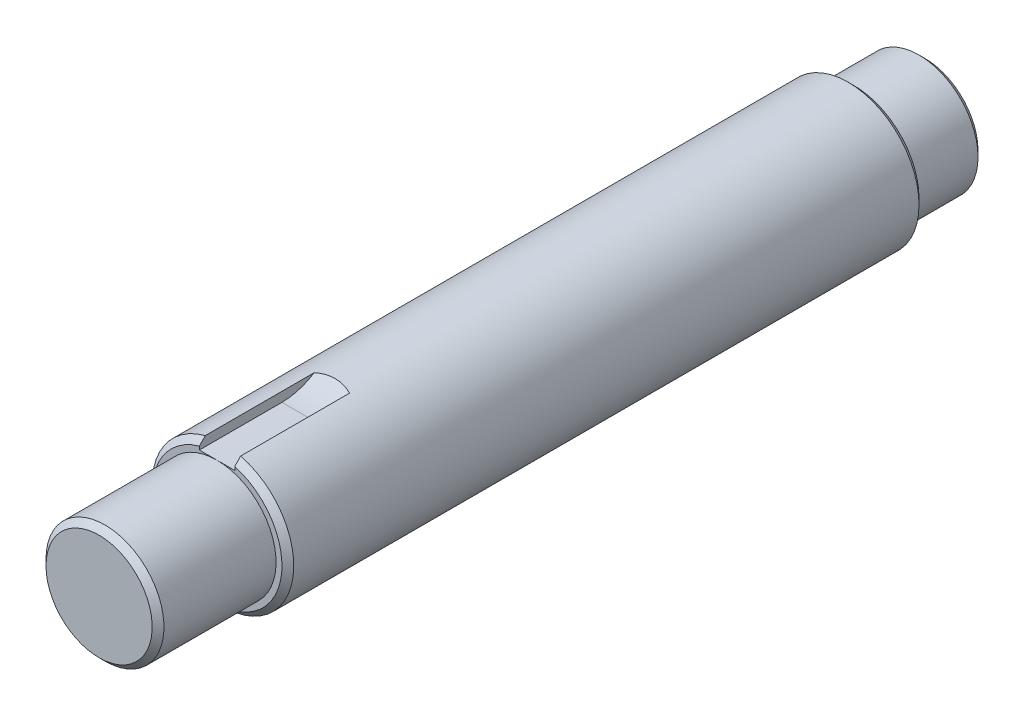
ISO-10303-21;
HEADER;
FILE_DESCRIPTION(('STEP AP214'),'2;1');
FILE_NAME('part.step','',(''),(''),'','','');
FILE_SCHEMA(('AUTOMOTIVE_DESIGN { 1 0 10303 214 1 1 1 1 }'));
ENDSEC;
DATA;
#1=APPLICATION_CONTEXT('core data for automotive mechanical design processes');
#2=APPLICATION_PROTOCOL_DEFINITION('international standard','automotive_design',2000,#1);
#3=PRODUCT_CONTEXT('',#1,'mechanical');
#4=PRODUCT('Part','Part','',(#3));
#5=PRODUCT_RELATED_PRODUCT_CATEGORY('part','',(#4));
#6=PRODUCT_DEFINITION_FORMATION('','',#4);
#7=PRODUCT_DEFINITION_CONTEXT('part definition',#1,'design');
#8=PRODUCT_DEFINITION('design','',#6,#7);
#9=PRODUCT_DEFINITION_SHAPE('','',#8);
#10=(LENGTH_UNIT() NAMED_UNIT(*) SI_UNIT(.MILLI.,.METRE.));
#11=(NAMED_UNIT(*) PLANE_ANGLE_UNIT() SI_UNIT($,.RADIAN.));
#12=(NAMED_UNIT(*) SI_UNIT($,.STERADIAN.) SOLID_ANGLE_UNIT());
#13=UNCERTAINTY_MEASURE_WITH_UNIT(LENGTH_MEASURE(1.E-05),#10,'distance_accuracy_value','');
#14=(GEOMETRIC_REPRESENTATION_CONTEXT(3) GLOBAL_UNCERTAINTY_ASSIGNED_CONTEXT((#13)) GLOBAL_UNIT_ASSIGNED_CONTEXT((#10,
#11,#12)) REPRESENTATION_CONTEXT('',''));
#15=CARTESIAN_POINT('',(0.,0.,0.));
#16=DIRECTION('',(0.,0.,1.));
#17=DIRECTION('',(1.,0.,0.));
#18=AXIS2_PLACEMENT_3D('',#15,#16,#17);
#19=CARTESIAN_POINT('',(0.,0.,59.9999999999999));
#20=DIRECTION('',(0.,0.,-0.999999999999999));
#21=DIRECTION('',(-1.,0.,0.));
#22=AXIS2_PLACEMENT_3D('',#19,#20,#21);
#23=CYLINDRICAL_SURFACE('',#22,6.);
#24=CARTESIAN_POINT('',(0.,0.,6.50000000000001));
#25=DIRECTION('',(0.,0.,0.999999999999999));
#26=DIRECTION('',(1.,0.,0.));
#27=AXIS2_PLACEMENT_3D('',#24,#25,#26);
#28=CIRCLE('',#27,6.);
#29=CARTESIAN_POINT('',(6.00000000000001,0.,6.50000000000001));
#30=VERTEX_POINT('',#29);
#31=EDGE_CURVE('E137',#30,#30,#28,.T.);
#32=ORIENTED_EDGE('',*,*,#31,.T.);
#33=EDGE_LOOP('',(#32));
#34=FACE_BOUND('',#33,.T.);
#35=DIRECTION('',(0.,0.,-0.999999999999999));
#36=VECTOR('',#35,1.);
#37=CARTESIAN_POINT('',(-1.50000000000001,5.80947501931113,59.9999999999999));
#38=LINE('',#37,#36);
#39=CARTESIAN_POINT('',(-1.50000000000001,5.80947501931113,50.2724552457892));
#40=VERTEX_POINT('',#39);
#41=CARTESIAN_POINT('',(-1.50000000000001,5.80947501931113,59.4999999999999));
#42=VERTEX_POINT('',#41);
#43=EDGE_CURVE('E123',#40,#42,#38,.F.);
#44=ORIENTED_EDGE('',*,*,#43,.F.);
#45=CARTESIAN_POINT('',(-1.50000000000001,5.80947501931113,50.2724552457892));
#46=CARTESIAN_POINT('',(-1.41080581062758,5.83252696194827,50.2370749961732));
#47=CARTESIAN_POINT('',(-1.31975291206148,5.85382425720757,50.2053002619477));
#48=CARTESIAN_POINT('',(-1.13471485218547,5.89247677973145,50.1487761297571));
#49=CARTESIAN_POINT('',(-1.0407308387278,5.90983352864103,50.1240240190756));
#50=CARTESIAN_POINT('',(-0.850537159187262,5.94019201410184,50.0813304918829));
#51=CARTESIAN_POINT('',(-0.75432729761696,5.95319336657167,50.0633896760084));
#52=CARTESIAN_POINT('',(-0.560390568806688,5.97456907787226,50.0341548308636));
#53=CARTESIAN_POINT('',(-0.462663583888499,5.98294307591221,50.0228613198734));
#54=CARTESIAN_POINT('',(-0.266489168146344,5.99488378340502,50.0068172396103));
#55=CARTESIAN_POINT('',(-0.168042613928242,5.99845559531514,50.00205972554));
#56=CARTESIAN_POINT('',(0.0290064624173928,6.0007389171753,49.9990144079675));
#57=CARTESIAN_POINT('',(0.127608985703024,5.99945039086553,50.000726652732));
#58=CARTESIAN_POINT('',(0.324204679953278,5.99204094373895,50.0106350249763));
#59=CARTESIAN_POINT('',(0.422198385699468,5.98592514257701,50.0188242831594));
#60=CARTESIAN_POINT('',(0.616969267627237,5.96899562609556,50.0417565395766));
#61=CARTESIAN_POINT('',(0.713746767723083,5.9581831901451,50.0564977530755));
#62=CARTESIAN_POINT('',(0.928516110138473,5.92893182145794,50.0970391777133));
#63=CARTESIAN_POINT('',(1.04601589722992,5.90928444863197,50.1246458887623));
#64=CARTESIAN_POINT('',(1.21896998486667,5.87516597703851,50.1740244933161));
#65=CARTESIAN_POINT('',(1.27606104206496,5.86302146491975,50.1918077842138));
#66=CARTESIAN_POINT('',(1.38900170229353,5.83729650378941,50.2300851731379));
#67=CARTESIAN_POINT('',(1.44485121338124,5.82371594885773,50.2505794711517));
#68=CARTESIAN_POINT('',(1.5,5.80947501931112,50.2724552457892));
#69=B_SPLINE_CURVE_WITH_KNOTS('',3,(#45,#46,#47,#48,#49,#50,#51,#52,#53,#54,#55,#56,#57,#58,#59,
#60,#61,#62,#63,#64,#65,#66,#67,#68),.UNSPECIFIED.,.F.,.F.,(4,2,2,2,2,2,2,2,2,2,2,4),(0.,
0.29592502580249,0.59173558482833,0.887572223097387,1.18343192423877,1.47897701706527,
1.77452431476525,2.06975858484294,2.36491248312871,2.73100974529955,2.91398552442623,
3.09697480896419),.UNSPECIFIED.);
#70=CARTESIAN_POINT('',(1.49999999999999,5.80947501931112,50.2724552457892));
#71=VERTEX_POINT('',#70);
#72=EDGE_CURVE('E11',#40,#71,#69,.T.);
#73=ORIENTED_EDGE('',*,*,#72,.T.);
#74=DIRECTION('',(0.,0.,-0.999999999999999));
#75=VECTOR('',#74,1.);
#76=CARTESIAN_POINT('',(1.49999999999999,5.80947501931112,59.9999999999999));
#77=LINE('',#76,#75);
#78=CARTESIAN_POINT('',(1.49999999999999,5.80947501931112,59.4999999999999));
#79=VERTEX_POINT('',#78);
#80=EDGE_CURVE('E119',#71,#79,#77,.F.);
#81=ORIENTED_EDGE('',*,*,#80,.T.);
#82=CARTESIAN_POINT('',(0.,0.,59.4999999999999));
#83=DIRECTION('',(0.,0.,0.999999999999999));
#84=DIRECTION('',(1.,0.,0.));
#85=AXIS2_PLACEMENT_3D('',#82,#83,#84);
#86=CIRCLE('',#85,6.);
#87=EDGE_CURVE('E140',#79,#42,#86,.F.);
#88=ORIENTED_EDGE('',*,*,#87,.T.);
#89=EDGE_LOOP('',(#44,#73,#81,#88));
#90=FACE_BOUND('',#89,.T.);
#91=ADVANCED_FACE('F34',(#34,#90),#23,.T.);
#92=CARTESIAN_POINT('',(0.,0.,59.9999999999999));
#93=DIRECTION('',(0.,0.,0.999999999999999));
#94=DIRECTION('',(1.,0.,0.));
#95=AXIS2_PLACEMENT_3D('',#92,#93,#94);
#96=PLANE('',#95);
#97=DIRECTION('',(1.,0.,0.));
#98=VECTOR('',#97,1.);
#99=CARTESIAN_POINT('',(-1.50000000000001,5.,59.9999999999999));
#100=LINE('',#99,#98);
#101=CARTESIAN_POINT('',(-1.50000000000001,5.,59.9999999999999));
#102=VERTEX_POINT('',#101);
#103=CARTESIAN_POINT('',(0.,5.,59.9999999999999));
#104=VERTEX_POINT('',#103);
#105=EDGE_CURVE('E63',#102,#104,#100,.T.);
#106=ORIENTED_EDGE('',*,*,#105,.F.);
#107=DIRECTION('',(0.,-1.,0.));
#108=VECTOR('',#107,1.);
#109=CARTESIAN_POINT('',(-1.50000000000001,5.,59.9999999999999));
#110=LINE('',#109,#108);
#111=CARTESIAN_POINT('',(-1.50000000000001,5.29150262212917,59.9999999999999));
#112=VERTEX_POINT('',#111);
#113=EDGE_CURVE('E111',#112,#102,#110,.T.);
#114=ORIENTED_EDGE('',*,*,#113,.F.);
#115=CARTESIAN_POINT('',(0.,0.,59.9999999999999));
#116=DIRECTION('',(0.,0.,0.999999999999999));
#117=DIRECTION('',(1.,0.,0.));
#118=AXIS2_PLACEMENT_3D('',#115,#116,#117);
#119=CIRCLE('',#118,5.49999999999999);
#120=CARTESIAN_POINT('',(1.5,5.29150262212917,59.9999999999999));
#121=VERTEX_POINT('',#120);
#122=EDGE_CURVE('E107',#112,#121,#119,.T.);
#123=ORIENTED_EDGE('',*,*,#122,.T.);
#124=DIRECTION('',(0.,-1.,0.));
#125=VECTOR('',#124,1.);
#126=CARTESIAN_POINT('',(1.5,5.,59.9999999999999));
#127=LINE('',#126,#125);
#128=CARTESIAN_POINT('',(1.5,5.,59.9999999999999));
#129=VERTEX_POINT('',#128);
#130=EDGE_CURVE('E55',#121,#129,#127,.T.);
#131=ORIENTED_EDGE('',*,*,#130,.T.);
#132=EDGE_CURVE('E90',#104,#129,#100,.T.);
#133=ORIENTED_EDGE('',*,*,#132,.F.);
#134=CARTESIAN_POINT('',(0.,0.,59.9999999999999));
#135=DIRECTION('',(0.,0.,0.999999999999999));
#136=DIRECTION('',(1.,0.,0.));
#137=AXIS2_PLACEMENT_3D('',#134,#135,#136);
#138=CIRCLE('',#137,5.);
#139=EDGE_CURVE('E126',#104,#104,#138,.T.);
#140=ORIENTED_EDGE('',*,*,#139,.F.);
#141=EDGE_LOOP('',(#106,#114,#123,#131,#133,#140));
#142=FACE_BOUND('',#141,.T.);
#143=ADVANCED_FACE('F104',(#142),#96,.T.);
#144=CARTESIAN_POINT('',(0.,0.,59.9999999999999));
#145=DIRECTION('',(0.,0.,-0.999999999999999));
#146=DIRECTION('',(-1.,0.,0.));
#147=AXIS2_PLACEMENT_3D('',#144,#145,#146);
#148=CONICAL_SURFACE('',#147,5.49999999999999,0.785398163397457);
#149=ORIENTED_EDGE('',*,*,#122,.F.);
#150=CARTESIAN_POINT('',(-1.50000000000001,3.78688131140673,61.4268599254773));
#151=CARTESIAN_POINT('',(-1.50000000000002,3.92239127179272,61.3008487424899));
#152=CARTESIAN_POINT('',(-1.50000000000002,4.05746801487185,61.1743740341473));
#153=CARTESIAN_POINT('',(-1.50000000000002,4.32692172834275,60.9206840027584));
#154=CARTESIAN_POINT('',(-1.50000000000002,4.46129870642971,60.7934686878892));
#155=CARTESIAN_POINT('',(-1.50000000000002,4.72951798701452,60.5384854138287));
#156=CARTESIAN_POINT('',(-1.50000000000002,4.86336030747444,60.4107174735086));
#157=CARTESIAN_POINT('',(-1.50000000000002,5.13062222915721,60.1547395589055));
#158=CARTESIAN_POINT('',(-1.50000000000001,5.26404182903892,60.0265295832228));
#159=CARTESIAN_POINT('',(-1.5,5.66378893682127,59.641384070027));
#160=CARTESIAN_POINT('',(-1.50000000000001,5.9296125128232,59.3839255477714));
#161=CARTESIAN_POINT('',(-1.50000000000002,6.32767526900221,58.9970376496472));
#162=CARTESIAN_POINT('',(-1.50000000000002,6.46025309092337,58.8679560429901));
#163=CARTESIAN_POINT('',(-1.50000000000002,6.72521616722907,58.6095959701382));
#164=CARTESIAN_POINT('',(-1.50000000000001,6.85760142208265,58.4803175044244));
#165=CARTESIAN_POINT('',(-1.50000000000001,6.98990732419963,58.350957798355));
#166=B_SPLINE_CURVE_WITH_KNOTS('',3,(#150,#151,#152,#153,#154,#155,#156,#157,#158,#159,#160,
#161,#162,#163,#164,#165),.UNSPECIFIED.,.F.,.F.,(4,2,2,2,2,2,2,4),(0.,0.555132552760562,
1.11025898788033,1.66536661373076,2.22047599898528,3.33066260466195,3.88577553498256,
4.44088711094073),.UNSPECIFIED.);
#167=EDGE_CURVE('E48',#112,#42,#166,.T.);
#168=ORIENTED_EDGE('',*,*,#167,.T.);
#169=ORIENTED_EDGE('',*,*,#87,.F.);
#170=CARTESIAN_POINT('',(1.5,3.78688131140673,61.4268599254773));
#171=CARTESIAN_POINT('',(1.49999999999999,3.92239127179272,61.3008487424899));
#172=CARTESIAN_POINT('',(1.49999999999999,4.05746801487185,61.1743740341473));
#173=CARTESIAN_POINT('',(1.49999999999998,4.32692172834275,60.9206840027584));
#174=CARTESIAN_POINT('',(1.49999999999999,4.46129870642971,60.7934686878892));
#175=CARTESIAN_POINT('',(1.49999999999999,4.72951798701452,60.5384854138287));
#176=CARTESIAN_POINT('',(1.49999999999998,4.86336030747444,60.4107174735087));
#177=CARTESIAN_POINT('',(1.49999999999999,5.13062222915722,60.1547395589055));
#178=CARTESIAN_POINT('',(1.49999999999999,5.26404182903892,60.0265295832228));
#179=CARTESIAN_POINT('',(1.5,5.66378893682126,59.641384070027));
#180=CARTESIAN_POINT('',(1.49999999999999,5.9296125128232,59.3839255477714));
#181=CARTESIAN_POINT('',(1.49999999999999,6.32767526900221,58.9970376496473));
#182=CARTESIAN_POINT('',(1.49999999999999,6.46025309092337,58.8679560429902));
#183=CARTESIAN_POINT('',(1.49999999999999,6.72521616722907,58.6095959701382));
#184=CARTESIAN_POINT('',(1.49999999999999,6.85760142208266,58.4803175044244));
#185=CARTESIAN_POINT('',(1.5,6.98990732419963,58.350957798355));
#186=B_SPLINE_CURVE_WITH_KNOTS('',3,(#170,#171,#172,#173,#174,#175,#176,#177,#178,#179,#180,
#181,#182,#183,#184,#185),.UNSPECIFIED.,.F.,.F.,(4,2,2,2,2,2,2,4),(0.,0.555132552760563,
1.11025898788033,1.66536661373076,2.22047599898528,3.33066260466195,3.88577553498256,
4.44088711094074),.UNSPECIFIED.);
#187=EDGE_CURVE('E152',#121,#79,#186,.T.);
#188=ORIENTED_EDGE('',*,*,#187,.F.);
#189=EDGE_LOOP('',(#149,#168,#169,#188));
#190=FACE_BOUND('',#189,.T.);
#191=ADVANCED_FACE('F164',(#190),#148,.T.);
#192=CARTESIAN_POINT('',(0.,0.,6.00000000000001));
#193=DIRECTION('',(0.,0.,-0.999999999999999));
#194=DIRECTION('',(-1.,0.,0.));
#195=AXIS2_PLACEMENT_3D('',#192,#193,#194);
#196=CYLINDRICAL_SURFACE('',#195,5.);
#197=CARTESIAN_POINT('',(0.,0.,0.500000000000014));
#198=DIRECTION('',(0.,0.,0.999999999999999));
#199=DIRECTION('',(1.,0.,0.));
#200=AXIS2_PLACEMENT_3D('',#197,#198,#199);
#201=CIRCLE('',#200,5.);
#202=CARTESIAN_POINT('',(-5.00000000000001,0.,0.500000000000014));
#203=VERTEX_POINT('',#202);
#204=EDGE_CURVE('E146',#203,#203,#201,.T.);
#205=CARTESIAN_POINT('',(0.,0.,6.00000000000001));
#206=DIRECTION('',(0.,0.,0.999999999999999));
#207=DIRECTION('',(1.,0.,0.));
#208=AXIS2_PLACEMENT_3D('',#205,#206,#207);
#209=CIRCLE('',#208,5.);
#210=CARTESIAN_POINT('',(-5.00000000000001,0.,6.));
#211=VERTEX_POINT('',#210);
#212=EDGE_CURVE('E125',#211,#211,#209,.T.);
#213=CARTESIAN_POINT('',(-5.00000000000001,0.,0.500000000000014));
#214=CARTESIAN_POINT('',(-5.00000000000001,0.,0.557291666666681));
#215=CARTESIAN_POINT('',(-5.00000000000001,0.,0.614583333333347));
#216=CARTESIAN_POINT('',(-5.00000000000001,0.,0.72916666666668));
#217=CARTESIAN_POINT('',(-5.00000000000001,0.,0.786458333333346));
#218=CARTESIAN_POINT('',(-5.00000000000001,0.,0.90104166666668));
#219=CARTESIAN_POINT('',(-5.00000000000001,0.,0.958333333333346));
#220=CARTESIAN_POINT('',(-5.00000000000001,0.,1.07291666666668));
#221=CARTESIAN_POINT('',(-5.00000000000001,0.,1.13020833333335));
#222=CARTESIAN_POINT('',(-5.00000000000001,0.,1.24479166666668));
#223=CARTESIAN_POINT('',(-5.00000000000001,0.,1.30208333333335));
#224=CARTESIAN_POINT('',(-5.00000000000001,0.,1.41666666666668));
#225=CARTESIAN_POINT('',(-5.00000000000001,0.,1.47395833333335));
#226=CARTESIAN_POINT('',(-5.00000000000001,0.,1.58854166666668));
#227=CARTESIAN_POINT('',(-5.00000000000001,0.,1.64583333333335));
#228=CARTESIAN_POINT('',(-5.00000000000001,0.,1.76041666666668));
#229=CARTESIAN_POINT('',(-5.00000000000001,0.,1.81770833333334));
#230=CARTESIAN_POINT('',(-5.00000000000001,0.,1.93229166666668));
#231=CARTESIAN_POINT('',(-5.00000000000001,0.,1.98958333333334));
#232=CARTESIAN_POINT('',(-5.00000000000001,0.,2.10416666666668));
#233=CARTESIAN_POINT('',(-5.00000000000001,0.,2.16145833333334));
#234=CARTESIAN_POINT('',(-5.00000000000001,0.,2.27604166666668));
#235=CARTESIAN_POINT('',(-5.00000000000001,0.,2.33333333333334));
#236=CARTESIAN_POINT('',(-5.00000000000001,0.,2.44791666666668));
#237=CARTESIAN_POINT('',(-5.00000000000001,0.,2.50520833333334));
#238=CARTESIAN_POINT('',(-5.00000000000001,0.,2.61979166666668));
#239=CARTESIAN_POINT('',(-5.00000000000001,0.,2.67708333333334));
#240=CARTESIAN_POINT('',(-5.00000000000001,0.,2.79166666666668));
#241=CARTESIAN_POINT('',(-5.00000000000001,0.,2.84895833333334));
#242=CARTESIAN_POINT('',(-5.00000000000001,0.,2.96354166666668));
#243=CARTESIAN_POINT('',(-5.00000000000001,0.,3.02083333333334));
#244=CARTESIAN_POINT('',(-5.00000000000001,0.,3.13541666666668));
#245=CARTESIAN_POINT('',(-5.00000000000001,0.,3.19270833333334));
#246=CARTESIAN_POINT('',(-5.00000000000001,0.,3.30729166666668));
#247=CARTESIAN_POINT('',(-5.00000000000001,0.,3.36458333333334));
#248=CARTESIAN_POINT('',(-5.00000000000001,0.,3.47916666666668));
#249=CARTESIAN_POINT('',(-5.00000000000001,0.,3.53645833333334));
#250=CARTESIAN_POINT('',(-5.00000000000001,0.,3.65104166666668));
#251=CARTESIAN_POINT('',(-5.00000000000001,0.,3.70833333333334));
#252=CARTESIAN_POINT('',(-5.00000000000001,0.,3.82291666666667));
#253=CARTESIAN_POINT('',(-5.00000000000001,0.,3.88020833333334));
#254=CARTESIAN_POINT('',(-5.00000000000001,0.,3.99479166666667));
#255=CARTESIAN_POINT('',(-5.00000000000001,0.,4.05208333333334));
#256=CARTESIAN_POINT('',(-5.00000000000001,0.,4.16666666666667));
#257=CARTESIAN_POINT('',(-5.00000000000001,0.,4.22395833333334));
#258=CARTESIAN_POINT('',(-5.00000000000001,0.,4.33854166666667));
#259=CARTESIAN_POINT('',(-5.00000000000001,0.,4.39583333333334));
#260=CARTESIAN_POINT('',(-5.00000000000001,0.,4.51041666666667));
#261=CARTESIAN_POINT('',(-5.00000000000001,0.,4.56770833333334));
#262=CARTESIAN_POINT('',(-5.00000000000001,0.,4.68229166666667));
#263=CARTESIAN_POINT('',(-5.00000000000001,0.,4.73958333333334));
#264=CARTESIAN_POINT('',(-5.00000000000001,0.,4.85416666666667));
#265=CARTESIAN_POINT('',(-5.00000000000001,0.,4.91145833333334));
#266=CARTESIAN_POINT('',(-5.00000000000001,0.,5.02604166666667));
#267=CARTESIAN_POINT('',(-5.00000000000001,0.,5.08333333333334));
#268=CARTESIAN_POINT('',(-5.00000000000001,0.,5.19791666666667));
#269=CARTESIAN_POINT('',(-5.00000000000001,0.,5.25520833333334));
#270=CARTESIAN_POINT('',(-5.00000000000001,0.,5.36979166666667));
#271=CARTESIAN_POINT('',(-5.00000000000001,0.,5.42708333333334));
#272=CARTESIAN_POINT('',(-5.00000000000001,0.,5.54166666666667));
#273=CARTESIAN_POINT('',(-5.00000000000001,0.,5.59895833333334));
#274=CARTESIAN_POINT('',(-5.00000000000001,0.,5.71354166666667));
#275=CARTESIAN_POINT('',(-5.00000000000001,0.,5.77083333333334));
#276=CARTESIAN_POINT('',(-5.00000000000001,0.,5.88541666666667));
#277=CARTESIAN_POINT('',(-5.00000000000001,0.,5.94270833333334));
#278=CARTESIAN_POINT('',(-5.00000000000001,0.,6.));
#279=B_SPLINE_CURVE_WITH_KNOTS('',3,(#213,#214,#215,#216,#217,#218,#219,#220,#221,#222,#223,
#224,#225,#226,#227,#228,#229,#230,#231,#232,#233,#234,#235,#236,#237,#238,#239,#240,#241,#242,
#243,#244,#245,#246,#247,#248,#249,#250,#251,#252,#253,#254,#255,#256,#257,#258,#259,#260,#261,
#262,#263,#264,#265,#266,#267,#268,#269,#270,#271,#272,#273,#274,#275,#276,#277,#278),
.UNSPECIFIED.,.F.,.F.,(4,2,2,2,2,2,2,2,2,2,2,2,2,2,2,2,2,2,2,2,2,2,2,2,2,2,2,2,2,2,2,2,4),(0.,
0.171874999999999,0.343749999999999,0.515624999999999,0.687499999999999,0.859374999999998,
1.03125,1.203125,1.375,1.546875,1.71875,1.890625,2.0625,2.234375,2.40625,2.578125,2.75,
2.92187499999999,3.09374999999999,3.26562499999999,3.43749999999999,3.60937499999999,
3.78124999999999,3.95312499999999,4.12499999999999,4.29687499999999,4.46874999999999,
4.64062499999999,4.81249999999999,4.98437499999999,5.15624999999999,5.32812499999999,
5.49999999999999),.UNSPECIFIED.);
#280=EDGE_CURVE('BSEAM36',#203,#211,#279,.T.);
#281=ORIENTED_EDGE('',*,*,#204,.T.);
#282=ORIENTED_EDGE('',*,*,#212,.F.);
#283=ORIENTED_EDGE('',*,*,#280,.T.);
#284=ORIENTED_EDGE('',*,*,#280,.F.);
#285=EDGE_LOOP('',(#281,#283,#282,#284));
#286=FACE_BOUND('',#285,.T.);
#287=ADVANCED_FACE('F36',(#286),#196,.T.);
#288=CARTESIAN_POINT('',(0.,0.,0.));
#289=DIRECTION('',(0.,0.,0.999999999999999));
#290=DIRECTION('',(1.,0.,0.));
#291=AXIS2_PLACEMENT_3D('',#288,#289,#290);
#292=PLANE('',#291);
#293=CARTESIAN_POINT('',(0.,0.,0.));
#294=DIRECTION('',(0.,0.,0.999999999999999));
#295=DIRECTION('',(1.,0.,0.));
#296=AXIS2_PLACEMENT_3D('',#293,#294,#295);
#297=CIRCLE('',#296,4.5);
#298=CARTESIAN_POINT('',(4.5,0.,0.));
#299=VERTEX_POINT('',#298);
#300=EDGE_CURVE('E149',#299,#299,#297,.F.);
#301=ORIENTED_EDGE('',*,*,#300,.T.);
#302=EDGE_LOOP('',(#301));
#303=FACE_BOUND('',#302,.T.);
#304=ADVANCED_FACE('F204',(#303),#292,.F.);
#305=CARTESIAN_POINT('',(0.,0.,6.00000000000001));
#306=DIRECTION('',(0.,0.,0.999999999999999));
#307=DIRECTION('',(1.,0.,0.));
#308=AXIS2_PLACEMENT_3D('',#305,#306,#307);
#309=PLANE('',#308);
#310=CARTESIAN_POINT('',(0.,0.,6.00000000000001));
#311=DIRECTION('',(0.,0.,0.999999999999999));
#312=DIRECTION('',(1.,0.,0.));
#313=AXIS2_PLACEMENT_3D('',#310,#311,#312);
#314=CIRCLE('',#313,5.5);
#315=CARTESIAN_POINT('',(5.50000000000001,0.,6.00000000000001));
#316=VERTEX_POINT('',#315);
#317=EDGE_CURVE('E143',#316,#316,#314,.F.);
#318=ORIENTED_EDGE('',*,*,#317,.T.);
#319=EDGE_LOOP('',(#318));
#320=FACE_BOUND('',#319,.T.);
#321=ORIENTED_EDGE('',*,*,#212,.T.);
#322=EDGE_LOOP('',(#321));
#323=FACE_BOUND('',#322,.T.);
#324=ADVANCED_FACE('F206',(#320,#323),#309,.F.);
#325=CARTESIAN_POINT('',(0.,0.,69.9999999999999));
#326=DIRECTION('',(0.,0.,-0.999999999999999));
#327=DIRECTION('',(-1.,0.,0.));
#328=AXIS2_PLACEMENT_3D('',#325,#326,#327);
#329=CYLINDRICAL_SURFACE('',#328,5.);
#330=CARTESIAN_POINT('',(0.,0.,69.4999999999999));
#331=DIRECTION('',(0.,0.,0.999999999999999));
#332=DIRECTION('',(1.,0.,0.));
#333=AXIS2_PLACEMENT_3D('',#330,#331,#332);
#334=CIRCLE('',#333,5.);
#335=CARTESIAN_POINT('',(-5.00000000000001,0.,69.4999999999999));
#336=VERTEX_POINT('',#335);
#337=EDGE_CURVE('E133',#336,#336,#334,.F.);
#338=ORIENTED_EDGE('',*,*,#337,.T.);
#339=EDGE_LOOP('',(#338));
#340=FACE_BOUND('',#339,.T.);
#341=ORIENTED_EDGE('',*,*,#139,.T.);
#342=EDGE_LOOP('',(#341));
#343=FACE_BOUND('',#342,.T.);
#344=ADVANCED_FACE('F212',(#340,#343),#329,.T.);
#345=CARTESIAN_POINT('',(0.,0.,69.9999999999999));
#346=DIRECTION('',(0.,0.,0.999999999999999));
#347=DIRECTION('',(1.,0.,0.));
#348=AXIS2_PLACEMENT_3D('',#345,#346,#347);
#349=PLANE('',#348);
#350=CARTESIAN_POINT('',(0.,0.,69.9999999999999));
#351=DIRECTION('',(0.,0.,0.999999999999999));
#352=DIRECTION('',(1.,0.,0.));
#353=AXIS2_PLACEMENT_3D('',#350,#351,#352);
#354=CIRCLE('',#353,4.49999999999999);
#355=CARTESIAN_POINT('',(-4.5,0.,69.9999999999999));
#356=VERTEX_POINT('',#355);
#357=EDGE_CURVE('E128',#356,#356,#354,.T.);
#358=ORIENTED_EDGE('',*,*,#357,.T.);
#359=EDGE_LOOP('',(#358));
#360=FACE_BOUND('',#359,.T.);
#361=ADVANCED_FACE('F191',(#360),#349,.T.);
#362=CARTESIAN_POINT('',(0.,0.,69.9999999999999));
#363=DIRECTION('',(0.,0.,-0.999999999999999));
#364=DIRECTION('',(-1.,0.,0.));
#365=AXIS2_PLACEMENT_3D('',#362,#363,#364);
#366=CONICAL_SURFACE('',#365,4.49999999999999,0.785398163397457);
#367=CARTESIAN_POINT('',(-5.00000000000001,0.,69.4999999999999));
#368=CARTESIAN_POINT('',(-4.99479166666668,0.,69.5052083333332));
#369=CARTESIAN_POINT('',(-4.98958333333334,0.,69.5104166666665));
#370=CARTESIAN_POINT('',(-4.97916666666668,0.,69.5208333333332));
#371=CARTESIAN_POINT('',(-4.97395833333335,0.,69.5260416666665));
#372=CARTESIAN_POINT('',(-4.96354166666668,0.,69.5364583333332));
#373=CARTESIAN_POINT('',(-4.95833333333334,0.,69.5416666666665));
#374=CARTESIAN_POINT('',(-4.94791666666667,0.,69.5520833333332));
#375=CARTESIAN_POINT('',(-4.94270833333334,0.,69.5572916666665));
#376=CARTESIAN_POINT('',(-4.93229166666668,0.,69.5677083333332));
#377=CARTESIAN_POINT('',(-4.92708333333334,0.,69.5729166666665));
#378=CARTESIAN_POINT('',(-4.91666666666668,0.,69.5833333333332));
#379=CARTESIAN_POINT('',(-4.91145833333334,0.,69.5885416666665));
#380=CARTESIAN_POINT('',(-4.90104166666667,0.,69.5989583333332));
#381=CARTESIAN_POINT('',(-4.89583333333334,0.,69.6041666666665));
#382=CARTESIAN_POINT('',(-4.88541666666668,0.,69.6145833333332));
#383=CARTESIAN_POINT('',(-4.88020833333334,0.,69.6197916666665));
#384=CARTESIAN_POINT('',(-4.86979166666668,0.,69.6302083333332));
#385=CARTESIAN_POINT('',(-4.86458333333334,0.,69.6354166666665));
#386=CARTESIAN_POINT('',(-4.85416666666667,0.,69.6458333333332));
#387=CARTESIAN_POINT('',(-4.84895833333334,0.,69.6510416666665));
#388=CARTESIAN_POINT('',(-4.83854166666668,0.,69.6614583333332));
#389=CARTESIAN_POINT('',(-4.83333333333334,0.,69.6666666666665));
#390=CARTESIAN_POINT('',(-4.82291666666667,0.,69.6770833333332));
#391=CARTESIAN_POINT('',(-4.81770833333334,0.,69.6822916666665));
#392=CARTESIAN_POINT('',(-4.80729166666668,0.,69.6927083333332));
#393=CARTESIAN_POINT('',(-4.80208333333334,0.,69.6979166666665));
#394=CARTESIAN_POINT('',(-4.79166666666667,0.,69.7083333333332));
#395=CARTESIAN_POINT('',(-4.78645833333334,0.,69.7135416666665));
#396=CARTESIAN_POINT('',(-4.77604166666667,0.,69.7239583333332));
#397=CARTESIAN_POINT('',(-4.77083333333334,0.,69.7291666666665));
#398=CARTESIAN_POINT('',(-4.76041666666668,0.,69.7395833333332));
#399=CARTESIAN_POINT('',(-4.75520833333334,0.,69.7447916666665));
#400=CARTESIAN_POINT('',(-4.74479166666667,0.,69.7552083333332));
#401=CARTESIAN_POINT('',(-4.73958333333334,0.,69.7604166666665));
#402=CARTESIAN_POINT('',(-4.72916666666667,0.,69.7708333333332));
#403=CARTESIAN_POINT('',(-4.72395833333334,0.,69.7760416666665));
#404=CARTESIAN_POINT('',(-4.71354166666667,0.,69.7864583333332));
#405=CARTESIAN_POINT('',(-4.70833333333334,0.,69.7916666666665));
#406=CARTESIAN_POINT('',(-4.69791666666667,0.,69.8020833333332));
#407=CARTESIAN_POINT('',(-4.69270833333334,0.,69.8072916666665));
#408=CARTESIAN_POINT('',(-4.68229166666667,0.,69.8177083333332));
#409=CARTESIAN_POINT('',(-4.67708333333334,0.,69.8229166666665));
#410=CARTESIAN_POINT('',(-4.66666666666667,0.,69.8333333333332));
#411=CARTESIAN_POINT('',(-4.66145833333334,0.,69.8385416666665));
#412=CARTESIAN_POINT('',(-4.65104166666667,0.,69.8489583333332));
#413=CARTESIAN_POINT('',(-4.64583333333334,0.,69.8541666666665));
#414=CARTESIAN_POINT('',(-4.63541666666667,0.,69.8645833333332));
#415=CARTESIAN_POINT('',(-4.63020833333334,0.,69.8697916666665));
#416=CARTESIAN_POINT('',(-4.61979166666667,0.,69.8802083333332));
#417=CARTESIAN_POINT('',(-4.61458333333334,0.,69.8854166666665));
#418=CARTESIAN_POINT('',(-4.60416666666667,0.,69.8958333333332));
#419=CARTESIAN_POINT('',(-4.59895833333334,0.,69.9010416666665));
#420=CARTESIAN_POINT('',(-4.58854166666667,0.,69.9114583333332));
#421=CARTESIAN_POINT('',(-4.58333333333334,0.,69.9166666666665));
#422=CARTESIAN_POINT('',(-4.57291666666667,0.,69.9270833333332));
#423=CARTESIAN_POINT('',(-4.56770833333334,0.,69.9322916666665));
#424=CARTESIAN_POINT('',(-4.55729166666667,0.,69.9427083333332));
#425=CARTESIAN_POINT('',(-4.55208333333334,0.,69.9479166666665));
#426=CARTESIAN_POINT('',(-4.54166666666667,0.,69.9583333333332));
#427=CARTESIAN_POINT('',(-4.53645833333334,0.,69.9635416666665));
#428=CARTESIAN_POINT('',(-4.52604166666667,0.,69.9739583333332));
#429=CARTESIAN_POINT('',(-4.52083333333333,0.,69.9791666666665));
#430=CARTESIAN_POINT('',(-4.51041666666667,0.,69.9895833333332));
#431=CARTESIAN_POINT('',(-4.50520833333334,0.,69.9947916666665));
#432=CARTESIAN_POINT('',(-4.5,0.,69.9999999999999));
#433=B_SPLINE_CURVE_WITH_KNOTS('',3,(#367,#368,#369,#370,#371,#372,#373,#374,#375,#376,#377,
#378,#379,#380,#381,#382,#383,#384,#385,#386,#387,#388,#389,#390,#391,#392,#393,#394,#395,#396,
#397,#398,#399,#400,#401,#402,#403,#404,#405,#406,#407,#408,#409,#410,#411,#412,#413,#414,#415,
#416,#417,#418,#419,#420,#421,#422,#423,#424,#425,#426,#427,#428,#429,#430,#431,#432),
.UNSPECIFIED.,.F.,.F.,(4,2,2,2,2,2,2,2,2,2,2,2,2,2,2,2,2,2,2,2,2,2,2,2,2,2,2,2,2,2,2,2,4),(0.,
0.0220970869120839,0.0441941738241672,0.0662912607362414,0.0883883476483247,0.110485434560408,
0.132582521472481,0.154679608384565,0.176776695296649,0.198873782208722,0.220970869120806,
0.24306795603288,0.265165042944963,0.287262129857047,0.30935921676912,0.331456303681204,
0.353553390593278,0.375650477505361,0.397747564417444,0.419844651329519,0.441941738241602,
0.464038825153685,0.486135912065759,0.508232998977843,0.530330085889926,0.552427172802,
0.574524259714083,0.596621346626157,0.618718433538241,0.640815520450324,0.662912607362398,
0.685009694274482,0.707106781186565),.UNSPECIFIED.);
#434=EDGE_CURVE('BSEAM186',#336,#356,#433,.T.);
#435=ORIENTED_EDGE('',*,*,#337,.F.);
#436=ORIENTED_EDGE('',*,*,#357,.F.);
#437=ORIENTED_EDGE('',*,*,#434,.T.);
#438=ORIENTED_EDGE('',*,*,#434,.F.);
#439=EDGE_LOOP('',(#435,#437,#436,#438));
#440=FACE_BOUND('',#439,.T.);
#441=ADVANCED_FACE('F186',(#440),#366,.T.);
#442=CARTESIAN_POINT('',(0.,0.,6.50000000000001));
#443=DIRECTION('',(0.,0.,0.999999999999999));
#444=DIRECTION('',(1.,0.,0.));
#445=AXIS2_PLACEMENT_3D('',#442,#443,#444);
#446=CONICAL_SURFACE('',#445,6.,0.785398163397445);
#447=CARTESIAN_POINT('',(5.50000000000001,0.,6.00000000000001));
#448=CARTESIAN_POINT('',(5.50520833333334,0.,6.00520833333334));
#449=CARTESIAN_POINT('',(5.51041666666668,0.,6.01041666666667));
#450=CARTESIAN_POINT('',(5.52083333333334,0.,6.02083333333334));
#451=CARTESIAN_POINT('',(5.52604166666668,0.,6.02604166666667));
#452=CARTESIAN_POINT('',(5.53645833333334,0.,6.03645833333334));
#453=CARTESIAN_POINT('',(5.54166666666668,0.,6.04166666666667));
#454=CARTESIAN_POINT('',(5.55208333333334,0.,6.05208333333334));
#455=CARTESIAN_POINT('',(5.55729166666668,0.,6.05729166666667));
#456=CARTESIAN_POINT('',(5.56770833333334,0.,6.06770833333334));
#457=CARTESIAN_POINT('',(5.57291666666668,0.,6.07291666666667));
#458=CARTESIAN_POINT('',(5.58333333333334,0.,6.08333333333334));
#459=CARTESIAN_POINT('',(5.58854166666667,0.,6.08854166666667));
#460=CARTESIAN_POINT('',(5.59895833333334,0.,6.09895833333334));
#461=CARTESIAN_POINT('',(5.60416666666667,0.,6.10416666666667));
#462=CARTESIAN_POINT('',(5.61458333333334,0.,6.11458333333334));
#463=CARTESIAN_POINT('',(5.61979166666667,0.,6.11979166666667));
#464=CARTESIAN_POINT('',(5.63020833333334,0.,6.13020833333334));
#465=CARTESIAN_POINT('',(5.63541666666667,0.,6.13541666666667));
#466=CARTESIAN_POINT('',(5.64583333333334,0.,6.14583333333334));
#467=CARTESIAN_POINT('',(5.65104166666667,0.,6.15104166666667));
#468=CARTESIAN_POINT('',(5.66145833333334,0.,6.16145833333334));
#469=CARTESIAN_POINT('',(5.66666666666667,0.,6.16666666666667));
#470=CARTESIAN_POINT('',(5.67708333333334,0.,6.17708333333334));
#471=CARTESIAN_POINT('',(5.68229166666667,0.,6.18229166666667));
#472=CARTESIAN_POINT('',(5.69270833333334,0.,6.19270833333334));
#473=CARTESIAN_POINT('',(5.69791666666667,0.,6.19791666666667));
#474=CARTESIAN_POINT('',(5.70833333333334,0.,6.20833333333334));
#475=CARTESIAN_POINT('',(5.71354166666667,0.,6.21354166666667));
#476=CARTESIAN_POINT('',(5.72395833333334,0.,6.22395833333334));
#477=CARTESIAN_POINT('',(5.72916666666667,0.,6.22916666666667));
#478=CARTESIAN_POINT('',(5.73958333333334,0.,6.23958333333334));
#479=CARTESIAN_POINT('',(5.74479166666667,0.,6.24479166666667));
#480=CARTESIAN_POINT('',(5.75520833333334,0.,6.25520833333334));
#481=CARTESIAN_POINT('',(5.76041666666667,0.,6.26041666666667));
#482=CARTESIAN_POINT('',(5.77083333333334,0.,6.27083333333334));
#483=CARTESIAN_POINT('',(5.77604166666667,0.,6.27604166666667));
#484=CARTESIAN_POINT('',(5.78645833333334,0.,6.28645833333334));
#485=CARTESIAN_POINT('',(5.79166666666667,0.,6.29166666666667));
#486=CARTESIAN_POINT('',(5.80208333333334,0.,6.30208333333334));
#487=CARTESIAN_POINT('',(5.80729166666667,0.,6.30729166666667));
#488=CARTESIAN_POINT('',(5.81770833333334,0.,6.31770833333334));
#489=CARTESIAN_POINT('',(5.82291666666667,0.,6.32291666666667));
#490=CARTESIAN_POINT('',(5.83333333333334,0.,6.33333333333334));
#491=CARTESIAN_POINT('',(5.83854166666667,0.,6.33854166666667));
#492=CARTESIAN_POINT('',(5.84895833333334,0.,6.34895833333334));
#493=CARTESIAN_POINT('',(5.85416666666667,0.,6.35416666666667));
#494=CARTESIAN_POINT('',(5.86458333333334,0.,6.36458333333334));
#495=CARTESIAN_POINT('',(5.86979166666667,0.,6.36979166666667));
#496=CARTESIAN_POINT('',(5.88020833333334,0.,6.38020833333334));
#497=CARTESIAN_POINT('',(5.88541666666667,0.,6.38541666666667));
#498=CARTESIAN_POINT('',(5.89583333333334,0.,6.39583333333334));
#499=CARTESIAN_POINT('',(5.90104166666667,0.,6.40104166666667));
#500=CARTESIAN_POINT('',(5.91145833333334,0.,6.41145833333334));
#501=CARTESIAN_POINT('',(5.91666666666667,0.,6.41666666666667));
#502=CARTESIAN_POINT('',(5.92708333333334,0.,6.42708333333334));
#503=CARTESIAN_POINT('',(5.93229166666667,0.,6.43229166666667));
#504=CARTESIAN_POINT('',(5.94270833333334,0.,6.44270833333334));
#505=CARTESIAN_POINT('',(5.94791666666667,0.,6.44791666666667));
#506=CARTESIAN_POINT('',(5.95833333333334,0.,6.45833333333334));
#507=CARTESIAN_POINT('',(5.96354166666667,0.,6.46354166666667));
#508=CARTESIAN_POINT('',(5.97395833333334,0.,6.47395833333334));
#509=CARTESIAN_POINT('',(5.97916666666667,0.,6.47916666666667));
#510=CARTESIAN_POINT('',(5.98958333333334,0.,6.48958333333334));
#511=CARTESIAN_POINT('',(5.99479166666667,0.,6.49479166666667));
#512=CARTESIAN_POINT('',(6.00000000000001,0.,6.50000000000001));
#513=B_SPLINE_CURVE_WITH_KNOTS('',3,(#447,#448,#449,#450,#451,#452,#453,#454,#455,#456,#457,
#458,#459,#460,#461,#462,#463,#464,#465,#466,#467,#468,#469,#470,#471,#472,#473,#474,#475,#476,
#477,#478,#479,#480,#481,#482,#483,#484,#485,#486,#487,#488,#489,#490,#491,#492,#493,#494,#495,
#496,#497,#498,#499,#500,#501,#502,#503,#504,#505,#506,#507,#508,#509,#510,#511,#512),
.UNSPECIFIED.,.F.,.F.,(4,2,2,2,2,2,2,2,2,2,2,2,2,2,2,2,2,2,2,2,2,2,2,2,2,2,2,2,2,2,2,2,4),(0.,
0.0220970869120796,0.0441941738241593,0.0662912607362389,0.0883883476483185,0.110485434560398,
0.132582521472478,0.154679608384557,0.176776695296636,0.198873782208716,0.220970869120796,
0.243067956032875,0.265165042944955,0.287262129857035,0.309359216769115,0.331456303681193,
0.353553390593273,0.375650477505353,0.397747564417432,0.419844651329512,0.441941738241591,
0.464038825153671,0.486135912065751,0.50823299897783,0.530330085889909,0.552427172801989,
0.574524259714069,0.596621346626149,0.618718433538228,0.640815520450308,0.662912607362388,
0.685009694274467,0.707106781186546),.UNSPECIFIED.);
#514=EDGE_CURVE('BSEAM183',#316,#30,#513,.T.);
#515=ORIENTED_EDGE('',*,*,#317,.F.);
#516=ORIENTED_EDGE('',*,*,#31,.F.);
#517=ORIENTED_EDGE('',*,*,#514,.T.);
#518=ORIENTED_EDGE('',*,*,#514,.F.);
#519=EDGE_LOOP('',(#515,#517,#516,#518));
#520=FACE_BOUND('',#519,.T.);
#521=ADVANCED_FACE('F183',(#520),#446,.T.);
#522=CARTESIAN_POINT('',(0.,0.,0.500000000000014));
#523=DIRECTION('',(0.,0.,0.999999999999999));
#524=DIRECTION('',(1.,0.,0.));
#525=AXIS2_PLACEMENT_3D('',#522,#523,#524);
#526=CONICAL_SURFACE('',#525,5.,0.785398163397443);
#527=ORIENTED_EDGE('',*,*,#300,.F.);
#528=EDGE_LOOP('',(#527));
#529=FACE_BOUND('',#528,.T.);
#530=ORIENTED_EDGE('',*,*,#204,.F.);
#531=EDGE_LOOP('',(#530));
#532=FACE_BOUND('',#531,.T.);
#533=ADVANCED_FACE('F178',(#529,#532),#526,.T.);
#534=CARTESIAN_POINT('',(-1.50000000000001,10.,53.));
#535=DIRECTION('',(1.,0.,0.));
#536=DIRECTION('',(0.,0.,-0.999999999999999));
#537=AXIS2_PLACEMENT_3D('',#534,#535,#536);
#538=CYLINDRICAL_SURFACE('',#537,5.);
#539=CARTESIAN_POINT('',(-1.50000000000001,10.,53.));
#540=DIRECTION('',(1.,0.,0.));
#541=DIRECTION('',(0.,0.,-0.999999999999999));
#542=AXIS2_PLACEMENT_3D('',#539,#540,#541);
#543=CIRCLE('',#542,5.);
#544=CARTESIAN_POINT('',(-1.50000000000001,5.,53.));
#545=VERTEX_POINT('',#544);
#546=EDGE_CURVE('E96',#545,#40,#543,.T.);
#547=ORIENTED_EDGE('',*,*,#546,.F.);
#548=DIRECTION('',(1.,0.,0.));
#549=VECTOR('',#548,1.);
#550=CARTESIAN_POINT('',(-1.50000000000001,5.,53.));
#551=LINE('',#550,#549);
#552=CARTESIAN_POINT('',(1.5,5.,53.));
#553=VERTEX_POINT('',#552);
#554=EDGE_CURVE('E118',#545,#553,#551,.T.);
#555=ORIENTED_EDGE('',*,*,#554,.T.);
#556=CARTESIAN_POINT('',(1.49999999999999,10.,53.));
#557=DIRECTION('',(1.,0.,0.));
#558=DIRECTION('',(0.,0.,-0.999999999999999));
#559=AXIS2_PLACEMENT_3D('',#556,#557,#558);
#560=CIRCLE('',#559,5.);
#561=EDGE_CURVE('E101',#553,#71,#560,.T.);
#562=ORIENTED_EDGE('',*,*,#561,.T.);
#563=ORIENTED_EDGE('',*,*,#72,.F.);
#564=EDGE_LOOP('',(#547,#555,#562,#563));
#565=FACE_BOUND('',#564,.T.);
#566=ADVANCED_FACE('F173',(#565),#538,.F.);
#567=CARTESIAN_POINT('',(-1.50000000000001,10.,53.));
#568=DIRECTION('',(1.,0.,0.));
#569=DIRECTION('',(0.,0.,-0.999999999999999));
#570=AXIS2_PLACEMENT_3D('',#567,#568,#569);
#571=PLANE('',#570);
#572=ORIENTED_EDGE('',*,*,#43,.T.);
#573=ORIENTED_EDGE('',*,*,#167,.F.);
#574=ORIENTED_EDGE('',*,*,#113,.T.);
#575=DIRECTION('',(0.,0.,-0.999999999999999));
#576=VECTOR('',#575,1.);
#577=CARTESIAN_POINT('',(-1.50000000000001,5.,59.9999999999999));
#578=LINE('',#577,#576);
#579=EDGE_CURVE('E113',#102,#545,#578,.T.);
#580=ORIENTED_EDGE('',*,*,#579,.T.);
#581=ORIENTED_EDGE('',*,*,#546,.T.);
#582=EDGE_LOOP('',(#572,#573,#574,#580,#581));
#583=FACE_BOUND('',#582,.T.);
#584=ADVANCED_FACE('F170',(#583),#571,.T.);
#585=CARTESIAN_POINT('',(1.49999999999999,10.,53.));
#586=DIRECTION('',(1.,0.,0.));
#587=DIRECTION('',(0.,0.,-0.999999999999999));
#588=AXIS2_PLACEMENT_3D('',#585,#586,#587);
#589=PLANE('',#588);
#590=ORIENTED_EDGE('',*,*,#561,.F.);
#591=DIRECTION('',(0.,0.,-0.999999999999999));
#592=VECTOR('',#591,1.);
#593=CARTESIAN_POINT('',(1.5,5.,59.9999999999999));
#594=LINE('',#593,#592);
#595=EDGE_CURVE('E92',#129,#553,#594,.T.);
#596=ORIENTED_EDGE('',*,*,#595,.F.);
#597=ORIENTED_EDGE('',*,*,#130,.F.);
#598=ORIENTED_EDGE('',*,*,#187,.T.);
#599=ORIENTED_EDGE('',*,*,#80,.F.);
#600=EDGE_LOOP('',(#590,#596,#597,#598,#599));
#601=FACE_BOUND('',#600,.T.);
#602=ADVANCED_FACE('F99',(#601),#589,.F.);
#603=CARTESIAN_POINT('',(-1.50000000000001,5.,59.9999999999999));
#604=DIRECTION('',(0.,-1.,0.));
#605=DIRECTION('',(0.,0.,-0.999999999999999));
#606=AXIS2_PLACEMENT_3D('',#603,#604,#605);
#607=PLANE('',#606);
#608=ORIENTED_EDGE('',*,*,#595,.T.);
#609=ORIENTED_EDGE('',*,*,#554,.F.);
#610=ORIENTED_EDGE('',*,*,#579,.F.);
#611=ORIENTED_EDGE('',*,*,#105,.T.);
#612=ORIENTED_EDGE('',*,*,#132,.T.);
#613=EDGE_LOOP('',(#608,#609,#610,#611,#612));
#614=FACE_BOUND('',#613,.T.);
#615=ADVANCED_FACE('F91',(#614),#607,.F.);
#616=CLOSED_SHELL('',(#91,#143,#191,#287,#304,#324,#344,#361,#441,#521,#533,#566,#584,#602,#615));
#617=MANIFOLD_SOLID_BREP('B2',#616);
#618=ADVANCED_BREP_SHAPE_REPRESENTATION('',(#18,#617),#14);
#619=SHAPE_DEFINITION_REPRESENTATION(#9,#618);
ENDSEC;
END-ISO-10303-21;
